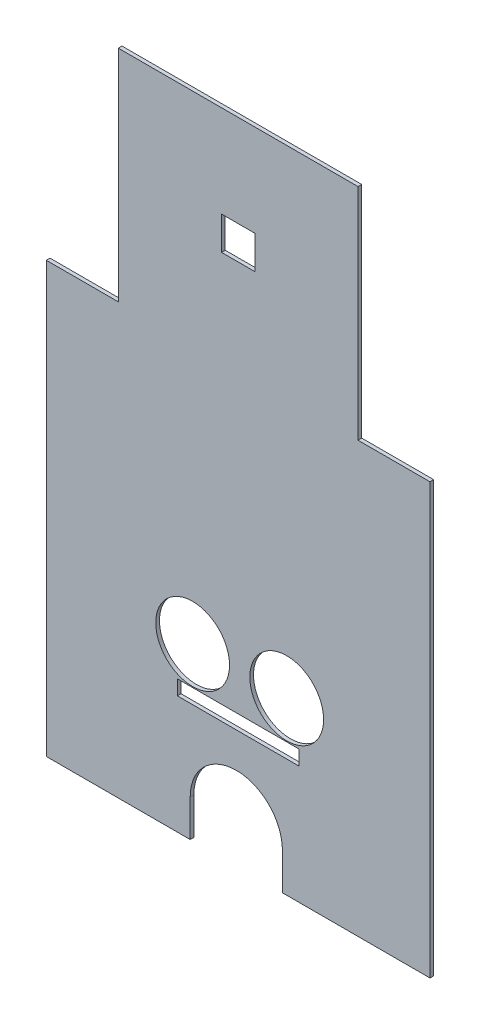
ISO-10303-21;
HEADER;
FILE_DESCRIPTION(('STEP AP214'),'2;1');
FILE_NAME('part.step','',(''),(''),'','','');
FILE_SCHEMA(('AUTOMOTIVE_DESIGN { 1 0 10303 214 1 1 1 1 }'));
ENDSEC;
DATA;
#1=APPLICATION_CONTEXT('core data for automotive mechanical design processes');
#2=APPLICATION_PROTOCOL_DEFINITION('international standard','automotive_design',2000,#1);
#3=PRODUCT_CONTEXT('',#1,'mechanical');
#4=PRODUCT('Part','Part','',(#3));
#5=PRODUCT_RELATED_PRODUCT_CATEGORY('part','',(#4));
#6=PRODUCT_DEFINITION_FORMATION('','',#4);
#7=PRODUCT_DEFINITION_CONTEXT('part definition',#1,'design');
#8=PRODUCT_DEFINITION('design','',#6,#7);
#9=PRODUCT_DEFINITION_SHAPE('','',#8);
#10=(LENGTH_UNIT() NAMED_UNIT(*) SI_UNIT(.MILLI.,.METRE.));
#11=(NAMED_UNIT(*) PLANE_ANGLE_UNIT() SI_UNIT($,.RADIAN.));
#12=(NAMED_UNIT(*) SI_UNIT($,.STERADIAN.) SOLID_ANGLE_UNIT());
#13=UNCERTAINTY_MEASURE_WITH_UNIT(LENGTH_MEASURE(1.E-05),#10,'distance_accuracy_value','');
#14=(GEOMETRIC_REPRESENTATION_CONTEXT(3) GLOBAL_UNCERTAINTY_ASSIGNED_CONTEXT((#13)) GLOBAL_UNIT_ASSIGNED_CONTEXT((#10,
#11,#12)) REPRESENTATION_CONTEXT('',''));
#15=CARTESIAN_POINT('',(0.,0.,0.));
#16=DIRECTION('',(0.,0.,1.));
#17=DIRECTION('',(1.,0.,0.));
#18=AXIS2_PLACEMENT_3D('',#15,#16,#17);
#19=CARTESIAN_POINT('',(0.,0.,0.));
#20=DIRECTION('',(0.,0.,-1.));
#21=DIRECTION('',(-1.,0.,0.));
#22=AXIS2_PLACEMENT_3D('',#19,#20,#21);
#23=PLANE('',#22);
#24=CARTESIAN_POINT('',(-12.3400000000026,51.2499999999999,0.));
#25=DIRECTION('',(0.,0.,1.));
#26=DIRECTION('',(1.,0.,0.));
#27=AXIS2_PLACEMENT_3D('',#24,#25,#26);
#28=CIRCLE('',#27,10.);
#29=CARTESIAN_POINT('',(-2.34000000000257,51.2499999999999,0.));
#30=VERTEX_POINT('',#29);
#31=EDGE_CURVE('E313',#30,#30,#28,.T.);
#32=ORIENTED_EDGE('',*,*,#31,.T.);
#33=EDGE_LOOP('',(#32));
#34=FACE_BOUND('',#33,.T.);
#35=CARTESIAN_POINT('',(13.1599999999974,51.2500000000001,0.));
#36=DIRECTION('',(0.,0.,1.));
#37=DIRECTION('',(1.,0.,0.));
#38=AXIS2_PLACEMENT_3D('',#35,#36,#37);
#39=CIRCLE('',#38,10.);
#40=CARTESIAN_POINT('',(23.1599999999974,51.2500000000001,0.));
#41=VERTEX_POINT('',#40);
#42=EDGE_CURVE('E312',#41,#41,#39,.T.);
#43=ORIENTED_EDGE('',*,*,#42,.T.);
#44=EDGE_LOOP('',(#43));
#45=FACE_BOUND('',#44,.T.);
#46=DIRECTION('',(0.,-1.,0.));
#47=VECTOR('',#46,1.);
#48=CARTESIAN_POINT('',(-16.4981669849044,41.,0.));
#49=LINE('',#48,#47);
#50=CARTESIAN_POINT('',(-16.4981669849044,41.,0.));
#51=VERTEX_POINT('',#50);
#52=CARTESIAN_POINT('',(-16.4981669849044,37.,0.));
#53=VERTEX_POINT('',#52);
#54=EDGE_CURVE('E317',#51,#53,#49,.T.);
#55=ORIENTED_EDGE('',*,*,#54,.T.);
#56=DIRECTION('',(1.,0.,0.));
#57=VECTOR('',#56,1.);
#58=CARTESIAN_POINT('',(-16.4981669849044,37.,0.));
#59=LINE('',#58,#57);
#60=CARTESIAN_POINT('',(16.5018330150956,37.,0.));
#61=VERTEX_POINT('',#60);
#62=EDGE_CURVE('E324',#53,#61,#59,.T.);
#63=ORIENTED_EDGE('',*,*,#62,.T.);
#64=DIRECTION('',(0.,1.,0.));
#65=VECTOR('',#64,1.);
#66=CARTESIAN_POINT('',(16.5018330150956,41.,0.));
#67=LINE('',#66,#65);
#68=CARTESIAN_POINT('',(16.5018330150956,41.,0.));
#69=VERTEX_POINT('',#68);
#70=EDGE_CURVE('E328',#61,#69,#67,.T.);
#71=ORIENTED_EDGE('',*,*,#70,.T.);
#72=DIRECTION('',(-1.,0.,0.));
#73=VECTOR('',#72,1.);
#74=CARTESIAN_POINT('',(-16.4981669849044,41.,0.));
#75=LINE('',#74,#73);
#76=EDGE_CURVE('E332',#69,#51,#75,.T.);
#77=ORIENTED_EDGE('',*,*,#76,.T.);
#78=EDGE_LOOP('',(#55,#63,#71,#77));
#79=FACE_BOUND('',#78,.T.);
#80=DIRECTION('',(0.,-1.,0.));
#81=VECTOR('',#80,1.);
#82=CARTESIAN_POINT('',(12.,0.,0.));
#83=LINE('',#82,#81);
#84=CARTESIAN_POINT('',(12.,15.0000000000013,0.));
#85=VERTEX_POINT('',#84);
#86=CARTESIAN_POINT('',(12.,5.,0.));
#87=VERTEX_POINT('',#86);
#88=EDGE_CURVE('E11',#85,#87,#83,.T.);
#89=ORIENTED_EDGE('',*,*,#88,.F.);
#90=CARTESIAN_POINT('',(-0.499999999999973,15.0000000000013,0.));
#91=DIRECTION('',(0.,0.,-1.));
#92=DIRECTION('',(-1.,0.,0.));
#93=AXIS2_PLACEMENT_3D('',#90,#91,#92);
#94=CIRCLE('',#93,12.5);
#95=CARTESIAN_POINT('',(-13.,15.0000000000013,0.));
#96=VERTEX_POINT('',#95);
#97=EDGE_CURVE('E54',#96,#85,#94,.T.);
#98=ORIENTED_EDGE('',*,*,#97,.F.);
#99=DIRECTION('',(0.,1.,0.));
#100=VECTOR('',#99,1.);
#101=CARTESIAN_POINT('',(-13.,0.,0.));
#102=LINE('',#101,#100);
#103=CARTESIAN_POINT('',(-13.,5.,0.));
#104=VERTEX_POINT('',#103);
#105=EDGE_CURVE('E399',#104,#96,#102,.T.);
#106=ORIENTED_EDGE('',*,*,#105,.F.);
#107=DIRECTION('',(1.,0.,0.));
#108=VECTOR('',#107,1.);
#109=CARTESIAN_POINT('',(-52.0000000000001,5.,0.));
#110=LINE('',#109,#108);
#111=CARTESIAN_POINT('',(-52.0000000000001,5.,0.));
#112=VERTEX_POINT('',#111);
#113=EDGE_CURVE('E373',#112,#104,#110,.T.);
#114=ORIENTED_EDGE('',*,*,#113,.F.);
#115=DIRECTION('',(0.,-1.,0.));
#116=VECTOR('',#115,1.);
#117=CARTESIAN_POINT('',(-52.0000000000001,5.,0.));
#118=LINE('',#117,#116);
#119=CARTESIAN_POINT('',(-52.0000000000001,121.5,0.));
#120=VERTEX_POINT('',#119);
#121=EDGE_CURVE('E357',#120,#112,#118,.T.);
#122=ORIENTED_EDGE('',*,*,#121,.F.);
#123=DIRECTION('',(-1.,0.,0.));
#124=VECTOR('',#123,1.);
#125=CARTESIAN_POINT('',(-52.0000000000001,121.5,0.));
#126=LINE('',#125,#124);
#127=CARTESIAN_POINT('',(-32.5,121.5,0.));
#128=VERTEX_POINT('',#127);
#129=EDGE_CURVE('E381',#128,#120,#126,.T.);
#130=ORIENTED_EDGE('',*,*,#129,.F.);
#131=DIRECTION('',(0.,1.,0.));
#132=VECTOR('',#131,1.);
#133=CARTESIAN_POINT('',(-32.5,121.5,0.));
#134=LINE('',#133,#132);
#135=CARTESIAN_POINT('',(-32.5,181.05,0.));
#136=VERTEX_POINT('',#135);
#137=EDGE_CURVE('E247',#128,#136,#134,.T.);
#138=ORIENTED_EDGE('',*,*,#137,.T.);
#139=DIRECTION('',(1.,0.,0.));
#140=VECTOR('',#139,1.);
#141=CARTESIAN_POINT('',(32.5,181.05,0.));
#142=LINE('',#141,#140);
#143=CARTESIAN_POINT('',(32.5,181.05,0.));
#144=VERTEX_POINT('',#143);
#145=EDGE_CURVE('E235',#136,#144,#142,.T.);
#146=ORIENTED_EDGE('',*,*,#145,.T.);
#147=DIRECTION('',(0.,-1.,0.));
#148=VECTOR('',#147,1.);
#149=CARTESIAN_POINT('',(32.5,121.5,0.));
#150=LINE('',#149,#148);
#151=CARTESIAN_POINT('',(32.5,121.5,0.));
#152=VERTEX_POINT('',#151);
#153=EDGE_CURVE('E225',#144,#152,#150,.T.);
#154=ORIENTED_EDGE('',*,*,#153,.T.);
#155=CARTESIAN_POINT('',(51.9999999999999,121.5,0.));
#156=VERTEX_POINT('',#155);
#157=EDGE_CURVE('E382',#156,#152,#126,.T.);
#158=ORIENTED_EDGE('',*,*,#157,.F.);
#159=DIRECTION('',(0.,1.,0.));
#160=VECTOR('',#159,1.);
#161=CARTESIAN_POINT('',(51.9999999999999,5.,0.));
#162=LINE('',#161,#160);
#163=CARTESIAN_POINT('',(51.9999999999999,5.,0.));
#164=VERTEX_POINT('',#163);
#165=EDGE_CURVE('E377',#164,#156,#162,.T.);
#166=ORIENTED_EDGE('',*,*,#165,.F.);
#167=EDGE_CURVE('E372',#87,#164,#110,.T.);
#168=ORIENTED_EDGE('',*,*,#167,.F.);
#169=EDGE_LOOP('',(#89,#98,#106,#114,#122,#130,#138,#146,#154,#158,#166,#168));
#170=FACE_BOUND('',#169,.T.);
#171=DIRECTION('',(-1.,0.,0.));
#172=VECTOR('',#171,1.);
#173=CARTESIAN_POINT('',(0.,147.1,0.));
#174=LINE('',#173,#172);
#175=CARTESIAN_POINT('',(4.50000000000062,147.1,0.));
#176=VERTEX_POINT('',#175);
#177=CARTESIAN_POINT('',(-4.49999999999935,147.1,0.));
#178=VERTEX_POINT('',#177);
#179=EDGE_CURVE('E216',#176,#178,#174,.T.);
#180=ORIENTED_EDGE('',*,*,#179,.F.);
#181=DIRECTION('',(0.,1.,0.));
#182=VECTOR('',#181,1.);
#183=CARTESIAN_POINT('',(4.50000000000062,0.,0.));
#184=LINE('',#183,#182);
#185=CARTESIAN_POINT('',(4.50000000000062,156.1,0.));
#186=VERTEX_POINT('',#185);
#187=EDGE_CURVE('E61',#176,#186,#184,.T.);
#188=ORIENTED_EDGE('',*,*,#187,.T.);
#189=DIRECTION('',(-1.,0.,0.));
#190=VECTOR('',#189,1.);
#191=CARTESIAN_POINT('',(0.,156.1,0.));
#192=LINE('',#191,#190);
#193=CARTESIAN_POINT('',(-4.49999999999935,156.1,0.));
#194=VERTEX_POINT('',#193);
#195=EDGE_CURVE('E203',#186,#194,#192,.T.);
#196=ORIENTED_EDGE('',*,*,#195,.T.);
#197=DIRECTION('',(0.,1.,0.));
#198=VECTOR('',#197,1.);
#199=CARTESIAN_POINT('',(-4.49999999999936,0.,0.));
#200=LINE('',#199,#198);
#201=EDGE_CURVE('E207',#178,#194,#200,.T.);
#202=ORIENTED_EDGE('',*,*,#201,.F.);
#203=EDGE_LOOP('',(#180,#188,#196,#202));
#204=FACE_BOUND('',#203,.T.);
#205=ADVANCED_FACE('F45',(#34,#45,#79,#170,#204),#23,.T.);
#206=CARTESIAN_POINT('',(-0.499999999999973,15.0000000000013,1.));
#207=DIRECTION('',(0.,0.,1.));
#208=DIRECTION('',(1.,0.,0.));
#209=AXIS2_PLACEMENT_3D('',#206,#207,#208);
#210=PLANE('',#209);
#211=CARTESIAN_POINT('',(13.1599999999974,51.2500000000001,1.));
#212=DIRECTION('',(0.,0.,1.));
#213=DIRECTION('',(1.,0.,0.));
#214=AXIS2_PLACEMENT_3D('',#211,#212,#213);
#215=CIRCLE('',#214,10.);
#216=CARTESIAN_POINT('',(23.1599999999974,51.2500000000001,1.));
#217=VERTEX_POINT('',#216);
#218=EDGE_CURVE('E296',#217,#217,#215,.F.);
#219=ORIENTED_EDGE('',*,*,#218,.T.);
#220=EDGE_LOOP('',(#219));
#221=FACE_BOUND('',#220,.T.);
#222=CARTESIAN_POINT('',(-12.3400000000026,51.2499999999999,1.));
#223=DIRECTION('',(0.,0.,1.));
#224=DIRECTION('',(1.,0.,0.));
#225=AXIS2_PLACEMENT_3D('',#222,#223,#224);
#226=CIRCLE('',#225,10.);
#227=CARTESIAN_POINT('',(-2.34000000000257,51.2499999999999,1.));
#228=VERTEX_POINT('',#227);
#229=EDGE_CURVE('E292',#228,#228,#226,.F.);
#230=ORIENTED_EDGE('',*,*,#229,.T.);
#231=EDGE_LOOP('',(#230));
#232=FACE_BOUND('',#231,.T.);
#233=CARTESIAN_POINT('',(-0.499999999999973,15.0000000000013,1.));
#234=DIRECTION('',(0.,0.,-1.));
#235=DIRECTION('',(1.,0.,0.));
#236=AXIS2_PLACEMENT_3D('',#233,#234,#235);
#237=CIRCLE('',#236,12.5);
#238=CARTESIAN_POINT('',(-13.,15.0000000000013,1.));
#239=VERTEX_POINT('',#238);
#240=CARTESIAN_POINT('',(12.,15.0000000000013,1.));
#241=VERTEX_POINT('',#240);
#242=EDGE_CURVE('E257',#239,#241,#237,.T.);
#243=ORIENTED_EDGE('',*,*,#242,.T.);
#244=DIRECTION('',(0.,-1.,0.));
#245=VECTOR('',#244,1.);
#246=CARTESIAN_POINT('',(12.,15.0000000000013,1.));
#247=LINE('',#246,#245);
#248=CARTESIAN_POINT('',(12.,5.,1.));
#249=VERTEX_POINT('',#248);
#250=EDGE_CURVE('E269',#241,#249,#247,.T.);
#251=ORIENTED_EDGE('',*,*,#250,.T.);
#252=DIRECTION('',(1.,0.,0.));
#253=VECTOR('',#252,1.);
#254=CARTESIAN_POINT('',(12.,5.,1.));
#255=LINE('',#254,#253);
#256=CARTESIAN_POINT('',(51.9999999999999,5.,1.));
#257=VERTEX_POINT('',#256);
#258=EDGE_CURVE('E272',#249,#257,#255,.T.);
#259=ORIENTED_EDGE('',*,*,#258,.T.);
#260=DIRECTION('',(0.,1.,0.));
#261=VECTOR('',#260,1.);
#262=CARTESIAN_POINT('',(51.9999999999999,5.,1.));
#263=LINE('',#262,#261);
#264=CARTESIAN_POINT('',(51.9999999999999,121.5,1.));
#265=VERTEX_POINT('',#264);
#266=EDGE_CURVE('E275',#257,#265,#263,.T.);
#267=ORIENTED_EDGE('',*,*,#266,.T.);
#268=DIRECTION('',(-1.,0.,0.));
#269=VECTOR('',#268,1.);
#270=CARTESIAN_POINT('',(51.9999999999999,121.5,1.));
#271=LINE('',#270,#269);
#272=CARTESIAN_POINT('',(32.5,121.5,1.));
#273=VERTEX_POINT('',#272);
#274=EDGE_CURVE('E279',#265,#273,#271,.T.);
#275=ORIENTED_EDGE('',*,*,#274,.T.);
#276=DIRECTION('',(0.,-1.,0.));
#277=VECTOR('',#276,1.);
#278=CARTESIAN_POINT('',(32.5,121.5,1.));
#279=LINE('',#278,#277);
#280=CARTESIAN_POINT('',(32.5,181.05,1.));
#281=VERTEX_POINT('',#280);
#282=EDGE_CURVE('E231',#281,#273,#279,.T.);
#283=ORIENTED_EDGE('',*,*,#282,.F.);
#284=DIRECTION('',(1.,0.,0.));
#285=VECTOR('',#284,1.);
#286=CARTESIAN_POINT('',(32.5,181.05,1.));
#287=LINE('',#286,#285);
#288=CARTESIAN_POINT('',(-32.5,181.05,1.));
#289=VERTEX_POINT('',#288);
#290=EDGE_CURVE('E239',#289,#281,#287,.T.);
#291=ORIENTED_EDGE('',*,*,#290,.F.);
#292=DIRECTION('',(0.,1.,0.));
#293=VECTOR('',#292,1.);
#294=CARTESIAN_POINT('',(-32.5,121.5,1.));
#295=LINE('',#294,#293);
#296=CARTESIAN_POINT('',(-32.5,121.5,1.));
#297=VERTEX_POINT('',#296);
#298=EDGE_CURVE('E234',#297,#289,#295,.T.);
#299=ORIENTED_EDGE('',*,*,#298,.F.);
#300=CARTESIAN_POINT('',(-52.0000000000001,121.5,1.));
#301=VERTEX_POINT('',#300);
#302=EDGE_CURVE('E278',#297,#301,#271,.T.);
#303=ORIENTED_EDGE('',*,*,#302,.T.);
#304=DIRECTION('',(0.,-1.,0.));
#305=VECTOR('',#304,1.);
#306=CARTESIAN_POINT('',(-52.0000000000001,121.5,1.));
#307=LINE('',#306,#305);
#308=CARTESIAN_POINT('',(-52.0000000000001,5.,1.));
#309=VERTEX_POINT('',#308);
#310=EDGE_CURVE('E283',#301,#309,#307,.T.);
#311=ORIENTED_EDGE('',*,*,#310,.T.);
#312=DIRECTION('',(1.,0.,0.));
#313=VECTOR('',#312,1.);
#314=CARTESIAN_POINT('',(-52.0000000000001,5.,1.));
#315=LINE('',#314,#313);
#316=CARTESIAN_POINT('',(-13.,5.,1.));
#317=VERTEX_POINT('',#316);
#318=EDGE_CURVE('E286',#309,#317,#315,.T.);
#319=ORIENTED_EDGE('',*,*,#318,.T.);
#320=DIRECTION('',(0.,1.,0.));
#321=VECTOR('',#320,1.);
#322=CARTESIAN_POINT('',(-13.,5.,1.));
#323=LINE('',#322,#321);
#324=EDGE_CURVE('E289',#317,#239,#323,.T.);
#325=ORIENTED_EDGE('',*,*,#324,.T.);
#326=EDGE_LOOP('',(#243,#251,#259,#267,#275,#283,#291,#299,#303,#311,#319,#325));
#327=FACE_BOUND('',#326,.T.);
#328=DIRECTION('',(0.,1.,0.));
#329=VECTOR('',#328,1.);
#330=CARTESIAN_POINT('',(-16.4981669849044,41.,1.));
#331=LINE('',#330,#329);
#332=CARTESIAN_POINT('',(-16.4981669849044,37.,1.));
#333=VERTEX_POINT('',#332);
#334=CARTESIAN_POINT('',(-16.4981669849044,41.,1.));
#335=VERTEX_POINT('',#334);
#336=EDGE_CURVE('E309',#333,#335,#331,.T.);
#337=ORIENTED_EDGE('',*,*,#336,.T.);
#338=DIRECTION('',(1.,0.,0.));
#339=VECTOR('',#338,1.);
#340=CARTESIAN_POINT('',(-16.4981669849044,41.,1.));
#341=LINE('',#340,#339);
#342=CARTESIAN_POINT('',(16.5018330150956,41.,1.));
#343=VERTEX_POINT('',#342);
#344=EDGE_CURVE('E306',#335,#343,#341,.T.);
#345=ORIENTED_EDGE('',*,*,#344,.T.);
#346=DIRECTION('',(0.,-1.,0.));
#347=VECTOR('',#346,1.);
#348=CARTESIAN_POINT('',(16.5018330150956,41.,1.));
#349=LINE('',#348,#347);
#350=CARTESIAN_POINT('',(16.5018330150956,37.,1.));
#351=VERTEX_POINT('',#350);
#352=EDGE_CURVE('E303',#343,#351,#349,.T.);
#353=ORIENTED_EDGE('',*,*,#352,.T.);
#354=DIRECTION('',(-1.,0.,0.));
#355=VECTOR('',#354,1.);
#356=CARTESIAN_POINT('',(-16.4981669849044,37.,1.));
#357=LINE('',#356,#355);
#358=EDGE_CURVE('E300',#351,#333,#357,.T.);
#359=ORIENTED_EDGE('',*,*,#358,.T.);
#360=EDGE_LOOP('',(#337,#345,#353,#359));
#361=FACE_BOUND('',#360,.T.);
#362=DIRECTION('',(-1.,0.,0.));
#363=VECTOR('',#362,1.);
#364=CARTESIAN_POINT('',(0.,156.1,1.));
#365=LINE('',#364,#363);
#366=CARTESIAN_POINT('',(4.50000000000062,156.1,1.));
#367=VERTEX_POINT('',#366);
#368=CARTESIAN_POINT('',(-4.49999999999935,156.1,1.));
#369=VERTEX_POINT('',#368);
#370=EDGE_CURVE('E192',#367,#369,#365,.T.);
#371=ORIENTED_EDGE('',*,*,#370,.F.);
#372=DIRECTION('',(0.,1.,0.));
#373=VECTOR('',#372,1.);
#374=CARTESIAN_POINT('',(4.50000000000062,0.,1.));
#375=LINE('',#374,#373);
#376=CARTESIAN_POINT('',(4.50000000000062,147.1,1.));
#377=VERTEX_POINT('',#376);
#378=EDGE_CURVE('E185',#377,#367,#375,.T.);
#379=ORIENTED_EDGE('',*,*,#378,.F.);
#380=DIRECTION('',(-1.,0.,0.));
#381=VECTOR('',#380,1.);
#382=CARTESIAN_POINT('',(0.,147.1,1.));
#383=LINE('',#382,#381);
#384=CARTESIAN_POINT('',(-4.49999999999935,147.1,1.));
#385=VERTEX_POINT('',#384);
#386=EDGE_CURVE('E195',#377,#385,#383,.T.);
#387=ORIENTED_EDGE('',*,*,#386,.T.);
#388=DIRECTION('',(0.,1.,0.));
#389=VECTOR('',#388,1.);
#390=CARTESIAN_POINT('',(-4.49999999999936,0.,1.));
#391=LINE('',#390,#389);
#392=EDGE_CURVE('E69',#385,#369,#391,.T.);
#393=ORIENTED_EDGE('',*,*,#392,.T.);
#394=EDGE_LOOP('',(#371,#379,#387,#393));
#395=FACE_BOUND('',#394,.T.);
#396=ADVANCED_FACE('F201',(#221,#232,#327,#361,#395),#210,.T.);
#397=CARTESIAN_POINT('',(-52.0000000000001,121.5,2.));
#398=DIRECTION('',(0.,-1.,0.));
#399=DIRECTION('',(0.,0.,-1.));
#400=AXIS2_PLACEMENT_3D('',#397,#398,#399);
#401=PLANE('',#400);
#402=DIRECTION('',(0.,0.,-1.));
#403=VECTOR('',#402,1.);
#404=CARTESIAN_POINT('',(32.5,121.5,1.));
#405=LINE('',#404,#403);
#406=EDGE_CURVE('E243',#273,#152,#405,.T.);
#407=ORIENTED_EDGE('',*,*,#406,.F.);
#408=ORIENTED_EDGE('',*,*,#274,.F.);
#409=DIRECTION('',(0.,0.,-1.));
#410=VECTOR('',#409,1.);
#411=CARTESIAN_POINT('',(51.9999999999999,121.5,2.));
#412=LINE('',#411,#410);
#413=EDGE_CURVE('E390',#265,#156,#412,.T.);
#414=ORIENTED_EDGE('',*,*,#413,.T.);
#415=ORIENTED_EDGE('',*,*,#157,.T.);
#416=EDGE_LOOP('',(#407,#408,#414,#415));
#417=FACE_BOUND('',#416,.T.);
#418=ADVANCED_FACE('F465',(#417),#401,.F.);
#419=CARTESIAN_POINT('',(-52.0000000000001,5.,2.));
#420=DIRECTION('',(0.,1.,0.));
#421=DIRECTION('',(0.,0.,1.));
#422=AXIS2_PLACEMENT_3D('',#419,#420,#421);
#423=PLANE('',#422);
#424=ORIENTED_EDGE('',*,*,#258,.F.);
#425=DIRECTION('',(0.,0.,1.));
#426=VECTOR('',#425,1.);
#427=CARTESIAN_POINT('',(12.,5.,-2.));
#428=LINE('',#427,#426);
#429=EDGE_CURVE('E358',#87,#249,#428,.T.);
#430=ORIENTED_EDGE('',*,*,#429,.F.);
#431=ORIENTED_EDGE('',*,*,#167,.T.);
#432=DIRECTION('',(0.,0.,-1.));
#433=VECTOR('',#432,1.);
#434=CARTESIAN_POINT('',(51.9999999999999,5.,2.));
#435=LINE('',#434,#433);
#436=EDGE_CURVE('E393',#257,#164,#435,.T.);
#437=ORIENTED_EDGE('',*,*,#436,.F.);
#438=EDGE_LOOP('',(#424,#430,#431,#437));
#439=FACE_BOUND('',#438,.T.);
#440=ADVANCED_FACE('F475',(#439),#423,.F.);
#441=CARTESIAN_POINT('',(-52.0000000000001,5.,2.));
#442=DIRECTION('',(1.,0.,0.));
#443=DIRECTION('',(0.,0.,-1.));
#444=AXIS2_PLACEMENT_3D('',#441,#442,#443);
#445=PLANE('',#444);
#446=ORIENTED_EDGE('',*,*,#310,.F.);
#447=DIRECTION('',(0.,0.,-1.));
#448=VECTOR('',#447,1.);
#449=CARTESIAN_POINT('',(-52.0000000000001,121.5,2.));
#450=LINE('',#449,#448);
#451=EDGE_CURVE('E386',#301,#120,#450,.T.);
#452=ORIENTED_EDGE('',*,*,#451,.T.);
#453=ORIENTED_EDGE('',*,*,#121,.T.);
#454=DIRECTION('',(0.,0.,-1.));
#455=VECTOR('',#454,1.);
#456=CARTESIAN_POINT('',(-52.0000000000001,5.,2.));
#457=LINE('',#456,#455);
#458=EDGE_CURVE('E396',#309,#112,#457,.T.);
#459=ORIENTED_EDGE('',*,*,#458,.F.);
#460=EDGE_LOOP('',(#446,#452,#453,#459));
#461=FACE_BOUND('',#460,.T.);
#462=ADVANCED_FACE('F47',(#461),#445,.F.);
#463=ORIENTED_EDGE('',*,*,#318,.F.);
#464=ORIENTED_EDGE('',*,*,#458,.T.);
#465=ORIENTED_EDGE('',*,*,#113,.T.);
#466=DIRECTION('',(0.,0.,1.));
#467=VECTOR('',#466,1.);
#468=CARTESIAN_POINT('',(-13.,5.,-2.));
#469=LINE('',#468,#467);
#470=EDGE_CURVE('E362',#104,#317,#469,.T.);
#471=ORIENTED_EDGE('',*,*,#470,.T.);
#472=EDGE_LOOP('',(#463,#464,#465,#471));
#473=FACE_BOUND('',#472,.T.);
#474=ADVANCED_FACE('F442',(#473),#423,.F.);
#475=CARTESIAN_POINT('',(51.9999999999999,5.,2.));
#476=DIRECTION('',(-1.,0.,0.));
#477=DIRECTION('',(0.,0.,1.));
#478=AXIS2_PLACEMENT_3D('',#475,#476,#477);
#479=PLANE('',#478);
#480=ORIENTED_EDGE('',*,*,#266,.F.);
#481=ORIENTED_EDGE('',*,*,#436,.T.);
#482=ORIENTED_EDGE('',*,*,#165,.T.);
#483=ORIENTED_EDGE('',*,*,#413,.F.);
#484=EDGE_LOOP('',(#480,#481,#482,#483));
#485=FACE_BOUND('',#484,.T.);
#486=ADVANCED_FACE('F472',(#485),#479,.F.);
#487=ORIENTED_EDGE('',*,*,#302,.F.);
#488=DIRECTION('',(0.,0.,-1.));
#489=VECTOR('',#488,1.);
#490=CARTESIAN_POINT('',(-32.5,121.5,1.));
#491=LINE('',#490,#489);
#492=EDGE_CURVE('E261',#297,#128,#491,.T.);
#493=ORIENTED_EDGE('',*,*,#492,.T.);
#494=ORIENTED_EDGE('',*,*,#129,.T.);
#495=ORIENTED_EDGE('',*,*,#451,.F.);
#496=EDGE_LOOP('',(#487,#493,#494,#495));
#497=FACE_BOUND('',#496,.T.);
#498=ADVANCED_FACE('F436',(#497),#401,.F.);
#499=CARTESIAN_POINT('',(-0.499999999999973,15.0000000000013,-2.));
#500=DIRECTION('',(0.,0.,1.));
#501=DIRECTION('',(1.,0.,0.));
#502=AXIS2_PLACEMENT_3D('',#499,#500,#501);
#503=CYLINDRICAL_SURFACE('',#502,12.5);
#504=ORIENTED_EDGE('',*,*,#242,.F.);
#505=DIRECTION('',(0.,0.,1.));
#506=VECTOR('',#505,1.);
#507=CARTESIAN_POINT('',(-13.,15.0000000000013,-2.));
#508=LINE('',#507,#506);
#509=EDGE_CURVE('E341',#96,#239,#508,.T.);
#510=ORIENTED_EDGE('',*,*,#509,.F.);
#511=ORIENTED_EDGE('',*,*,#97,.T.);
#512=DIRECTION('',(0.,0.,1.));
#513=VECTOR('',#512,1.);
#514=CARTESIAN_POINT('',(12.,15.0000000000013,-2.));
#515=LINE('',#514,#513);
#516=EDGE_CURVE('E353',#85,#241,#515,.T.);
#517=ORIENTED_EDGE('',*,*,#516,.T.);
#518=EDGE_LOOP('',(#504,#510,#511,#517));
#519=FACE_BOUND('',#518,.T.);
#520=ADVANCED_FACE('F407',(#519),#503,.F.);
#521=CARTESIAN_POINT('',(12.,15.0000000000013,-2.));
#522=DIRECTION('',(1.,0.,0.));
#523=DIRECTION('',(0.,1.,0.));
#524=AXIS2_PLACEMENT_3D('',#521,#522,#523);
#525=PLANE('',#524);
#526=ORIENTED_EDGE('',*,*,#250,.F.);
#527=ORIENTED_EDGE('',*,*,#516,.F.);
#528=ORIENTED_EDGE('',*,*,#88,.T.);
#529=ORIENTED_EDGE('',*,*,#429,.T.);
#530=EDGE_LOOP('',(#526,#527,#528,#529));
#531=FACE_BOUND('',#530,.T.);
#532=ADVANCED_FACE('F413',(#531),#525,.F.);
#533=CARTESIAN_POINT('',(-13.,15.0000000000013,-2.));
#534=DIRECTION('',(-1.,0.,0.));
#535=DIRECTION('',(0.,-1.,0.));
#536=AXIS2_PLACEMENT_3D('',#533,#534,#535);
#537=PLANE('',#536);
#538=ORIENTED_EDGE('',*,*,#324,.F.);
#539=ORIENTED_EDGE('',*,*,#470,.F.);
#540=ORIENTED_EDGE('',*,*,#105,.T.);
#541=ORIENTED_EDGE('',*,*,#509,.T.);
#542=EDGE_LOOP('',(#538,#539,#540,#541));
#543=FACE_BOUND('',#542,.T.);
#544=ADVANCED_FACE('F445',(#543),#537,.F.);
#545=CARTESIAN_POINT('',(-16.4981669849044,41.,0.));
#546=DIRECTION('',(-1.,0.,0.));
#547=DIRECTION('',(0.,0.,1.));
#548=AXIS2_PLACEMENT_3D('',#545,#546,#547);
#549=PLANE('',#548);
#550=ORIENTED_EDGE('',*,*,#336,.F.);
#551=DIRECTION('',(0.,0.,1.));
#552=VECTOR('',#551,1.);
#553=CARTESIAN_POINT('',(-16.4981669849044,37.,0.));
#554=LINE('',#553,#552);
#555=EDGE_CURVE('E336',#53,#333,#554,.T.);
#556=ORIENTED_EDGE('',*,*,#555,.F.);
#557=ORIENTED_EDGE('',*,*,#54,.F.);
#558=DIRECTION('',(0.,0.,1.));
#559=VECTOR('',#558,1.);
#560=CARTESIAN_POINT('',(-16.4981669849044,41.,0.));
#561=LINE('',#560,#559);
#562=EDGE_CURVE('E337',#51,#335,#561,.T.);
#563=ORIENTED_EDGE('',*,*,#562,.T.);
#564=EDGE_LOOP('',(#550,#556,#557,#563));
#565=FACE_BOUND('',#564,.T.);
#566=ADVANCED_FACE('F447',(#565),#549,.F.);
#567=CARTESIAN_POINT('',(-16.4981669849044,41.,0.));
#568=DIRECTION('',(0.,1.,0.));
#569=DIRECTION('',(0.,0.,1.));
#570=AXIS2_PLACEMENT_3D('',#567,#568,#569);
#571=PLANE('',#570);
#572=ORIENTED_EDGE('',*,*,#344,.F.);
#573=ORIENTED_EDGE('',*,*,#562,.F.);
#574=ORIENTED_EDGE('',*,*,#76,.F.);
#575=DIRECTION('',(0.,0.,1.));
#576=VECTOR('',#575,1.);
#577=CARTESIAN_POINT('',(16.5018330150956,41.,0.));
#578=LINE('',#577,#576);
#579=EDGE_CURVE('E342',#69,#343,#578,.T.);
#580=ORIENTED_EDGE('',*,*,#579,.T.);
#581=EDGE_LOOP('',(#572,#573,#574,#580));
#582=FACE_BOUND('',#581,.T.);
#583=ADVANCED_FACE('F453',(#582),#571,.F.);
#584=CARTESIAN_POINT('',(16.5018330150956,41.,0.));
#585=DIRECTION('',(1.,0.,0.));
#586=DIRECTION('',(0.,0.,-1.));
#587=AXIS2_PLACEMENT_3D('',#584,#585,#586);
#588=PLANE('',#587);
#589=ORIENTED_EDGE('',*,*,#352,.F.);
#590=ORIENTED_EDGE('',*,*,#579,.F.);
#591=ORIENTED_EDGE('',*,*,#70,.F.);
#592=DIRECTION('',(0.,0.,1.));
#593=VECTOR('',#592,1.);
#594=CARTESIAN_POINT('',(16.5018330150956,37.,0.));
#595=LINE('',#594,#593);
#596=EDGE_CURVE('E346',#61,#351,#595,.T.);
#597=ORIENTED_EDGE('',*,*,#596,.T.);
#598=EDGE_LOOP('',(#589,#590,#591,#597));
#599=FACE_BOUND('',#598,.T.);
#600=ADVANCED_FACE('F524',(#599),#588,.F.);
#601=CARTESIAN_POINT('',(-16.4981669849044,37.,0.));
#602=DIRECTION('',(0.,-1.,0.));
#603=DIRECTION('',(0.,0.,-1.));
#604=AXIS2_PLACEMENT_3D('',#601,#602,#603);
#605=PLANE('',#604);
#606=ORIENTED_EDGE('',*,*,#358,.F.);
#607=ORIENTED_EDGE('',*,*,#596,.F.);
#608=ORIENTED_EDGE('',*,*,#62,.F.);
#609=ORIENTED_EDGE('',*,*,#555,.T.);
#610=EDGE_LOOP('',(#606,#607,#608,#609));
#611=FACE_BOUND('',#610,.T.);
#612=ADVANCED_FACE('F535',(#611),#605,.F.);
#613=CARTESIAN_POINT('',(13.1599999999974,51.2500000000001,0.));
#614=DIRECTION('',(0.,0.,1.));
#615=DIRECTION('',(1.,0.,0.));
#616=AXIS2_PLACEMENT_3D('',#613,#614,#615);
#617=CYLINDRICAL_SURFACE('',#616,10.);
#618=ORIENTED_EDGE('',*,*,#42,.F.);
#619=EDGE_LOOP('',(#618));
#620=FACE_BOUND('',#619,.T.);
#621=ORIENTED_EDGE('',*,*,#218,.F.);
#622=EDGE_LOOP('',(#621));
#623=FACE_BOUND('',#622,.T.);
#624=ADVANCED_FACE('F546',(#620,#623),#617,.F.);
#625=CARTESIAN_POINT('',(-12.3400000000026,51.2499999999999,0.));
#626=DIRECTION('',(0.,0.,1.));
#627=DIRECTION('',(1.,0.,0.));
#628=AXIS2_PLACEMENT_3D('',#625,#626,#627);
#629=CYLINDRICAL_SURFACE('',#628,10.);
#630=ORIENTED_EDGE('',*,*,#31,.F.);
#631=EDGE_LOOP('',(#630));
#632=FACE_BOUND('',#631,.T.);
#633=ORIENTED_EDGE('',*,*,#229,.F.);
#634=EDGE_LOOP('',(#633));
#635=FACE_BOUND('',#634,.T.);
#636=ADVANCED_FACE('F557',(#632,#635),#629,.F.);
#637=CARTESIAN_POINT('',(32.5,121.5,1.));
#638=DIRECTION('',(1.,0.,0.));
#639=DIRECTION('',(0.,0.,-1.));
#640=AXIS2_PLACEMENT_3D('',#637,#638,#639);
#641=PLANE('',#640);
#642=ORIENTED_EDGE('',*,*,#153,.F.);
#643=DIRECTION('',(0.,0.,-1.));
#644=VECTOR('',#643,1.);
#645=CARTESIAN_POINT('',(32.5,181.05,1.));
#646=LINE('',#645,#644);
#647=EDGE_CURVE('E254',#281,#144,#646,.T.);
#648=ORIENTED_EDGE('',*,*,#647,.F.);
#649=ORIENTED_EDGE('',*,*,#282,.T.);
#650=ORIENTED_EDGE('',*,*,#406,.T.);
#651=EDGE_LOOP('',(#642,#648,#649,#650));
#652=FACE_BOUND('',#651,.T.);
#653=ADVANCED_FACE('F567',(#652),#641,.T.);
#654=CARTESIAN_POINT('',(32.5,181.05,1.));
#655=DIRECTION('',(0.,1.,0.));
#656=DIRECTION('',(0.,0.,1.));
#657=AXIS2_PLACEMENT_3D('',#654,#655,#656);
#658=PLANE('',#657);
#659=ORIENTED_EDGE('',*,*,#145,.F.);
#660=DIRECTION('',(0.,0.,-1.));
#661=VECTOR('',#660,1.);
#662=CARTESIAN_POINT('',(-32.5,181.05,1.));
#663=LINE('',#662,#661);
#664=EDGE_CURVE('E258',#289,#136,#663,.T.);
#665=ORIENTED_EDGE('',*,*,#664,.F.);
#666=ORIENTED_EDGE('',*,*,#290,.T.);
#667=ORIENTED_EDGE('',*,*,#647,.T.);
#668=EDGE_LOOP('',(#659,#665,#666,#667));
#669=FACE_BOUND('',#668,.T.);
#670=ADVANCED_FACE('F587',(#669),#658,.T.);
#671=CARTESIAN_POINT('',(-32.5,121.5,1.));
#672=DIRECTION('',(-1.,0.,0.));
#673=DIRECTION('',(0.,0.,1.));
#674=AXIS2_PLACEMENT_3D('',#671,#672,#673);
#675=PLANE('',#674);
#676=ORIENTED_EDGE('',*,*,#137,.F.);
#677=ORIENTED_EDGE('',*,*,#492,.F.);
#678=ORIENTED_EDGE('',*,*,#298,.T.);
#679=ORIENTED_EDGE('',*,*,#664,.T.);
#680=EDGE_LOOP('',(#676,#677,#678,#679));
#681=FACE_BOUND('',#680,.T.);
#682=ADVANCED_FACE('F598',(#681),#675,.T.);
#683=CARTESIAN_POINT('',(4.50000000000062,0.,1.));
#684=DIRECTION('',(-1.,0.,0.));
#685=DIRECTION('',(0.,0.,1.));
#686=AXIS2_PLACEMENT_3D('',#683,#684,#685);
#687=PLANE('',#686);
#688=ORIENTED_EDGE('',*,*,#187,.F.);
#689=DIRECTION('',(0.,0.,-1.));
#690=VECTOR('',#689,1.);
#691=CARTESIAN_POINT('',(4.50000000000062,147.1,1.));
#692=LINE('',#691,#690);
#693=EDGE_CURVE('E181',#377,#176,#692,.T.);
#694=ORIENTED_EDGE('',*,*,#693,.F.);
#695=ORIENTED_EDGE('',*,*,#378,.T.);
#696=DIRECTION('',(0.,0.,-1.));
#697=VECTOR('',#696,1.);
#698=CARTESIAN_POINT('',(4.50000000000062,156.1,1.));
#699=LINE('',#698,#697);
#700=EDGE_CURVE('E222',#367,#186,#699,.T.);
#701=ORIENTED_EDGE('',*,*,#700,.T.);
#702=EDGE_LOOP('',(#688,#694,#695,#701));
#703=FACE_BOUND('',#702,.T.);
#704=ADVANCED_FACE('F183',(#703),#687,.T.);
#705=CARTESIAN_POINT('',(0.,156.1,1.));
#706=DIRECTION('',(0.,-1.,0.));
#707=DIRECTION('',(0.,0.,-1.));
#708=AXIS2_PLACEMENT_3D('',#705,#706,#707);
#709=PLANE('',#708);
#710=ORIENTED_EDGE('',*,*,#195,.F.);
#711=ORIENTED_EDGE('',*,*,#700,.F.);
#712=ORIENTED_EDGE('',*,*,#370,.T.);
#713=DIRECTION('',(0.,0.,-1.));
#714=VECTOR('',#713,1.);
#715=CARTESIAN_POINT('',(-4.49999999999935,156.1,1.));
#716=LINE('',#715,#714);
#717=EDGE_CURVE('E226',#369,#194,#716,.T.);
#718=ORIENTED_EDGE('',*,*,#717,.T.);
#719=EDGE_LOOP('',(#710,#711,#712,#718));
#720=FACE_BOUND('',#719,.T.);
#721=ADVANCED_FACE('F620',(#720),#709,.T.);
#722=CARTESIAN_POINT('',(-4.49999999999936,0.,1.));
#723=DIRECTION('',(-1.,0.,0.));
#724=DIRECTION('',(0.,-1.,0.));
#725=AXIS2_PLACEMENT_3D('',#722,#723,#724);
#726=PLANE('',#725);
#727=ORIENTED_EDGE('',*,*,#201,.T.);
#728=ORIENTED_EDGE('',*,*,#717,.F.);
#729=ORIENTED_EDGE('',*,*,#392,.F.);
#730=DIRECTION('',(0.,0.,-1.));
#731=VECTOR('',#730,1.);
#732=CARTESIAN_POINT('',(-4.49999999999935,147.1,1.));
#733=LINE('',#732,#731);
#734=EDGE_CURVE('E191',#385,#178,#733,.T.);
#735=ORIENTED_EDGE('',*,*,#734,.T.);
#736=EDGE_LOOP('',(#727,#728,#729,#735));
#737=FACE_BOUND('',#736,.T.);
#738=ADVANCED_FACE('F631',(#737),#726,.F.);
#739=CARTESIAN_POINT('',(0.,147.1,1.));
#740=DIRECTION('',(0.,-1.,0.));
#741=DIRECTION('',(0.,0.,-1.));
#742=AXIS2_PLACEMENT_3D('',#739,#740,#741);
#743=PLANE('',#742);
#744=ORIENTED_EDGE('',*,*,#179,.T.);
#745=ORIENTED_EDGE('',*,*,#734,.F.);
#746=ORIENTED_EDGE('',*,*,#386,.F.);
#747=ORIENTED_EDGE('',*,*,#693,.T.);
#748=EDGE_LOOP('',(#744,#745,#746,#747));
#749=FACE_BOUND('',#748,.T.);
#750=ADVANCED_FACE('F196',(#749),#743,.F.);
#751=CLOSED_SHELL('',(#205,#396,#418,#440,#462,#474,#486,#498,#520,#532,#544,#566,#583,#600,
#612,#624,#636,#653,#670,#682,#704,#721,#738,#750));
#752=MANIFOLD_SOLID_BREP('B2',#751);
#753=ADVANCED_BREP_SHAPE_REPRESENTATION('',(#18,#752),#14);
#754=SHAPE_DEFINITION_REPRESENTATION(#9,#753);
ENDSEC;
END-ISO-10303-21;
